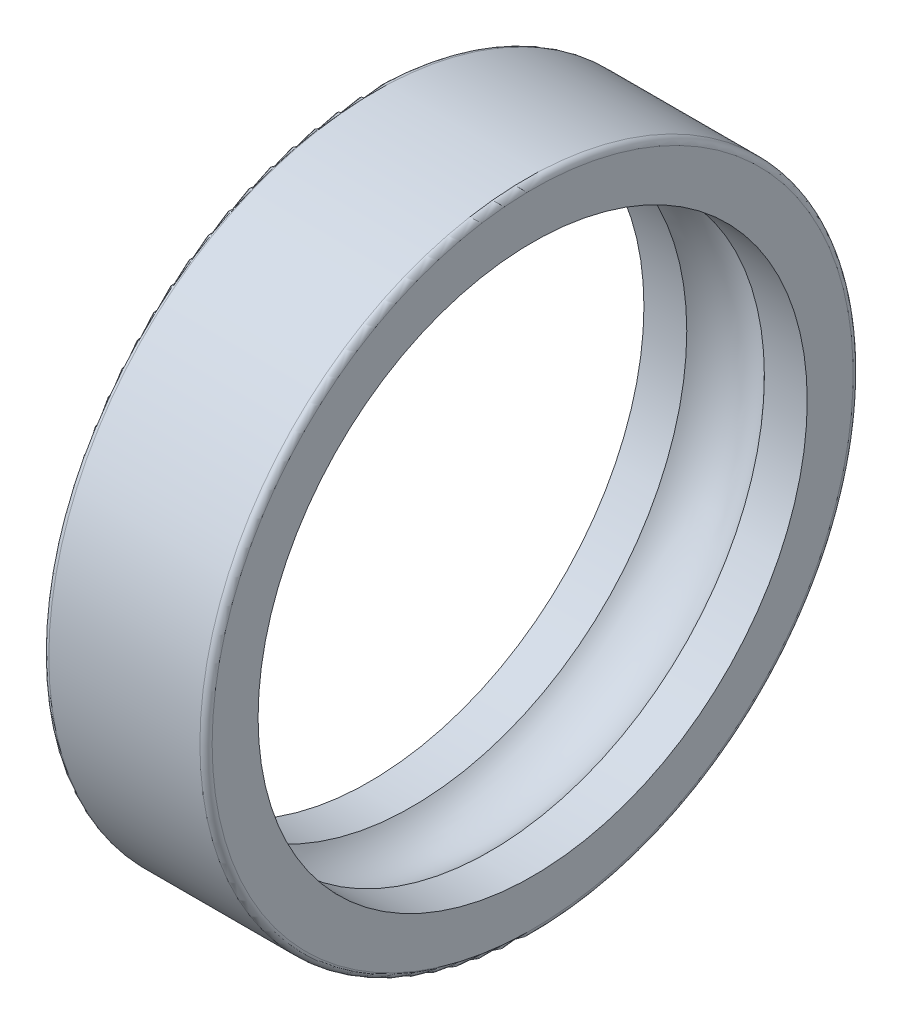
ISO-10303-21;
HEADER;
FILE_DESCRIPTION(('STEP AP214'),'2;1');
FILE_NAME('part.step','',(''),(''),'','','');
FILE_SCHEMA(('AUTOMOTIVE_DESIGN { 1 0 10303 214 1 1 1 1 }'));
ENDSEC;
DATA;
#1=APPLICATION_CONTEXT('core data for automotive mechanical design processes');
#2=APPLICATION_PROTOCOL_DEFINITION('international standard','automotive_design',2000,#1);
#3=PRODUCT_CONTEXT('',#1,'mechanical');
#4=PRODUCT('Part','Part','',(#3));
#5=PRODUCT_RELATED_PRODUCT_CATEGORY('part','',(#4));
#6=PRODUCT_DEFINITION_FORMATION('','',#4);
#7=PRODUCT_DEFINITION_CONTEXT('part definition',#1,'design');
#8=PRODUCT_DEFINITION('design','',#6,#7);
#9=PRODUCT_DEFINITION_SHAPE('','',#8);
#10=(LENGTH_UNIT() NAMED_UNIT(*) SI_UNIT(.MILLI.,.METRE.));
#11=(NAMED_UNIT(*) PLANE_ANGLE_UNIT() SI_UNIT($,.RADIAN.));
#12=(NAMED_UNIT(*) SI_UNIT($,.STERADIAN.) SOLID_ANGLE_UNIT());
#13=UNCERTAINTY_MEASURE_WITH_UNIT(LENGTH_MEASURE(1.E-05),#10,'distance_accuracy_value','');
#14=(GEOMETRIC_REPRESENTATION_CONTEXT(3) GLOBAL_UNCERTAINTY_ASSIGNED_CONTEXT((#13)) GLOBAL_UNIT_ASSIGNED_CONTEXT((#10,
#11,#12)) REPRESENTATION_CONTEXT('',''));
#15=CARTESIAN_POINT('',(0.,0.,0.));
#16=DIRECTION('',(0.,0.,1.));
#17=DIRECTION('',(1.,0.,0.));
#18=AXIS2_PLACEMENT_3D('',#15,#16,#17);
#19=CARTESIAN_POINT('',(0.3,0.,0.));
#20=DIRECTION('',(-1.,0.,0.));
#21=DIRECTION('',(0.,0.,1.));
#22=AXIS2_PLACEMENT_3D('',#19,#20,#21);
#23=TOROIDAL_SURFACE('',#22,15.7,0.300000000000002);
#24=CARTESIAN_POINT('',(0.,0.,0.));
#25=DIRECTION('',(-1.,0.,0.));
#26=DIRECTION('',(0.,0.,1.));
#27=AXIS2_PLACEMENT_3D('',#24,#25,#26);
#28=CIRCLE('',#27,15.7);
#29=CARTESIAN_POINT('',(0.,0.,15.7));
#30=VERTEX_POINT('',#29);
#31=EDGE_CURVE('E10',#30,#30,#28,.T.);
#32=ORIENTED_EDGE('',*,*,#31,.F.);
#33=EDGE_LOOP('',(#32));
#34=FACE_BOUND('',#33,.T.);
#35=CARTESIAN_POINT('',(0.300000000000001,0.,0.));
#36=DIRECTION('',(-1.,0.,0.));
#37=DIRECTION('',(0.,0.,1.));
#38=AXIS2_PLACEMENT_3D('',#35,#36,#37);
#39=CIRCLE('',#38,16.);
#40=CARTESIAN_POINT('',(0.300000000000001,0.,16.));
#41=VERTEX_POINT('',#40);
#42=EDGE_CURVE('E57',#41,#41,#39,.T.);
#43=ORIENTED_EDGE('',*,*,#42,.T.);
#44=EDGE_LOOP('',(#43));
#45=FACE_BOUND('',#44,.T.);
#46=ADVANCED_FACE('F29',(#34,#45),#23,.T.);
#47=CARTESIAN_POINT('',(0.,0.,-15.7));
#48=DIRECTION('',(1.,0.,0.));
#49=DIRECTION('',(0.,0.,-1.));
#50=AXIS2_PLACEMENT_3D('',#47,#48,#49);
#51=PLANE('',#50);
#52=CARTESIAN_POINT('',(0.,0.,0.));
#53=DIRECTION('',(-1.,0.,0.));
#54=DIRECTION('',(0.,0.,1.));
#55=AXIS2_PLACEMENT_3D('',#52,#53,#54);
#56=CIRCLE('',#55,13.45);
#57=CARTESIAN_POINT('',(0.,0.,13.45));
#58=VERTEX_POINT('',#57);
#59=EDGE_CURVE('E35',#58,#58,#56,.T.);
#60=ORIENTED_EDGE('',*,*,#59,.F.);
#61=EDGE_LOOP('',(#60));
#62=FACE_BOUND('',#61,.T.);
#63=ORIENTED_EDGE('',*,*,#31,.T.);
#64=EDGE_LOOP('',(#63));
#65=FACE_BOUND('',#64,.T.);
#66=ADVANCED_FACE('F94',(#62,#65),#51,.F.);
#67=CARTESIAN_POINT('',(0.,0.,0.));
#68=DIRECTION('',(-1.,0.,0.));
#69=DIRECTION('',(0.,0.,1.));
#70=AXIS2_PLACEMENT_3D('',#67,#68,#69);
#71=CYLINDRICAL_SURFACE('',#70,13.45);
#72=CARTESIAN_POINT('',(2.09934221912518,0.,0.));
#73=DIRECTION('',(-1.,0.,0.));
#74=DIRECTION('',(0.,0.,1.));
#75=AXIS2_PLACEMENT_3D('',#72,#73,#74);
#76=CIRCLE('',#75,13.45);
#77=CARTESIAN_POINT('',(2.09934221912518,0.,13.45));
#78=VERTEX_POINT('',#77);
#79=EDGE_CURVE('E39',#78,#78,#76,.T.);
#80=ORIENTED_EDGE('',*,*,#79,.F.);
#81=EDGE_LOOP('',(#80));
#82=FACE_BOUND('',#81,.T.);
#83=ORIENTED_EDGE('',*,*,#59,.T.);
#84=EDGE_LOOP('',(#83));
#85=FACE_BOUND('',#84,.T.);
#86=ADVANCED_FACE('F89',(#82,#85),#71,.F.);
#87=CARTESIAN_POINT('',(4.,0.,0.));
#88=DIRECTION('',(-1.,0.,0.));
#89=DIRECTION('',(0.,0.,1.));
#90=AXIS2_PLACEMENT_3D('',#87,#88,#89);
#91=TOROIDAL_SURFACE('',#90,11.75,2.55);
#92=CARTESIAN_POINT('',(5.90065778087482,0.,0.));
#93=DIRECTION('',(-1.,0.,0.));
#94=DIRECTION('',(0.,0.,1.));
#95=AXIS2_PLACEMENT_3D('',#92,#93,#94);
#96=CIRCLE('',#95,13.45);
#97=CARTESIAN_POINT('',(5.90065778087482,0.,13.45));
#98=VERTEX_POINT('',#97);
#99=EDGE_CURVE('E43',#98,#98,#96,.T.);
#100=ORIENTED_EDGE('',*,*,#99,.F.);
#101=EDGE_LOOP('',(#100));
#102=FACE_BOUND('',#101,.T.);
#103=ORIENTED_EDGE('',*,*,#79,.T.);
#104=EDGE_LOOP('',(#103));
#105=FACE_BOUND('',#104,.T.);
#106=ADVANCED_FACE('F83',(#102,#105),#91,.F.);
#107=CARTESIAN_POINT('',(0.,0.,0.));
#108=DIRECTION('',(-1.,0.,0.));
#109=DIRECTION('',(0.,0.,1.));
#110=AXIS2_PLACEMENT_3D('',#107,#108,#109);
#111=CYLINDRICAL_SURFACE('',#110,13.45);
#112=CARTESIAN_POINT('',(8.,0.,0.));
#113=DIRECTION('',(-1.,0.,0.));
#114=DIRECTION('',(0.,0.,1.));
#115=AXIS2_PLACEMENT_3D('',#112,#113,#114);
#116=CIRCLE('',#115,13.45);
#117=CARTESIAN_POINT('',(8.,0.,13.45));
#118=VERTEX_POINT('',#117);
#119=EDGE_CURVE('E48',#118,#118,#116,.T.);
#120=ORIENTED_EDGE('',*,*,#119,.F.);
#121=EDGE_LOOP('',(#120));
#122=FACE_BOUND('',#121,.T.);
#123=ORIENTED_EDGE('',*,*,#99,.T.);
#124=EDGE_LOOP('',(#123));
#125=FACE_BOUND('',#124,.T.);
#126=ADVANCED_FACE('F77',(#122,#125),#111,.F.);
#127=CARTESIAN_POINT('',(8.,0.,-15.7));
#128=DIRECTION('',(-1.,0.,0.));
#129=DIRECTION('',(0.,0.,1.));
#130=AXIS2_PLACEMENT_3D('',#127,#128,#129);
#131=PLANE('',#130);
#132=CARTESIAN_POINT('',(8.,0.,0.));
#133=DIRECTION('',(-1.,0.,0.));
#134=DIRECTION('',(0.,0.,1.));
#135=AXIS2_PLACEMENT_3D('',#132,#133,#134);
#136=CIRCLE('',#135,15.7);
#137=CARTESIAN_POINT('',(8.,0.,15.7));
#138=VERTEX_POINT('',#137);
#139=EDGE_CURVE('E51',#138,#138,#136,.T.);
#140=ORIENTED_EDGE('',*,*,#139,.F.);
#141=EDGE_LOOP('',(#140));
#142=FACE_BOUND('',#141,.T.);
#143=ORIENTED_EDGE('',*,*,#119,.T.);
#144=EDGE_LOOP('',(#143));
#145=FACE_BOUND('',#144,.T.);
#146=ADVANCED_FACE('F71',(#142,#145),#131,.F.);
#147=CARTESIAN_POINT('',(7.7,0.,0.));
#148=DIRECTION('',(-1.,0.,0.));
#149=DIRECTION('',(0.,0.,1.));
#150=AXIS2_PLACEMENT_3D('',#147,#148,#149);
#151=TOROIDAL_SURFACE('',#150,15.7,0.300000000000002);
#152=CARTESIAN_POINT('',(7.7,0.,0.));
#153=DIRECTION('',(-1.,0.,0.));
#154=DIRECTION('',(0.,0.,1.));
#155=AXIS2_PLACEMENT_3D('',#152,#153,#154);
#156=CIRCLE('',#155,16.);
#157=CARTESIAN_POINT('',(7.7,0.,16.));
#158=VERTEX_POINT('',#157);
#159=EDGE_CURVE('E54',#158,#158,#156,.T.);
#160=ORIENTED_EDGE('',*,*,#159,.F.);
#161=EDGE_LOOP('',(#160));
#162=FACE_BOUND('',#161,.T.);
#163=ORIENTED_EDGE('',*,*,#139,.T.);
#164=EDGE_LOOP('',(#163));
#165=FACE_BOUND('',#164,.T.);
#166=ADVANCED_FACE('F65',(#162,#165),#151,.T.);
#167=CARTESIAN_POINT('',(0.,0.,0.));
#168=DIRECTION('',(-1.,0.,0.));
#169=DIRECTION('',(0.,0.,1.));
#170=AXIS2_PLACEMENT_3D('',#167,#168,#169);
#171=CYLINDRICAL_SURFACE('',#170,16.);
#172=ORIENTED_EDGE('',*,*,#42,.F.);
#173=EDGE_LOOP('',(#172));
#174=FACE_BOUND('',#173,.T.);
#175=ORIENTED_EDGE('',*,*,#159,.T.);
#176=EDGE_LOOP('',(#175));
#177=FACE_BOUND('',#176,.T.);
#178=ADVANCED_FACE('F62',(#174,#177),#171,.T.);
#179=CLOSED_SHELL('',(#46,#66,#86,#106,#126,#146,#166,#178));
#180=MANIFOLD_SOLID_BREP('B2',#179);
#181=ADVANCED_BREP_SHAPE_REPRESENTATION('',(#18,#180),#14);
#182=SHAPE_DEFINITION_REPRESENTATION(#9,#181);
ENDSEC;
END-ISO-10303-21;
